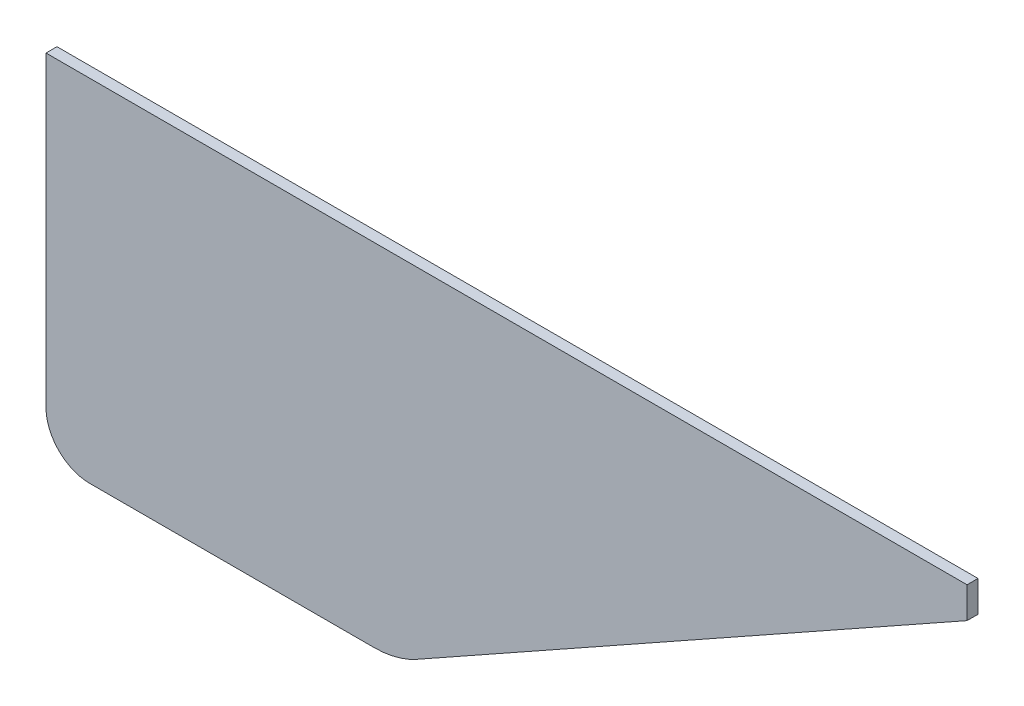
ISO-10303-21;
HEADER;
FILE_DESCRIPTION(('STEP AP214'),'2;1');
FILE_NAME('part.step','',(''),(''),'','','');
FILE_SCHEMA(('AUTOMOTIVE_DESIGN { 1 0 10303 214 1 1 1 1 }'));
ENDSEC;
DATA;
#1=APPLICATION_CONTEXT('core data for automotive mechanical design processes');
#2=APPLICATION_PROTOCOL_DEFINITION('international standard','automotive_design',2000,#1);
#3=PRODUCT_CONTEXT('',#1,'mechanical');
#4=PRODUCT('Part','Part','',(#3));
#5=PRODUCT_RELATED_PRODUCT_CATEGORY('part','',(#4));
#6=PRODUCT_DEFINITION_FORMATION('','',#4);
#7=PRODUCT_DEFINITION_CONTEXT('part definition',#1,'design');
#8=PRODUCT_DEFINITION('design','',#6,#7);
#9=PRODUCT_DEFINITION_SHAPE('','',#8);
#10=(LENGTH_UNIT() NAMED_UNIT(*) SI_UNIT(.MILLI.,.METRE.));
#11=(NAMED_UNIT(*) PLANE_ANGLE_UNIT() SI_UNIT($,.RADIAN.));
#12=(NAMED_UNIT(*) SI_UNIT($,.STERADIAN.) SOLID_ANGLE_UNIT());
#13=UNCERTAINTY_MEASURE_WITH_UNIT(LENGTH_MEASURE(1.E-05),#10,'distance_accuracy_value','');
#14=(GEOMETRIC_REPRESENTATION_CONTEXT(3) GLOBAL_UNCERTAINTY_ASSIGNED_CONTEXT((#13)) GLOBAL_UNIT_ASSIGNED_CONTEXT((#10,
#11,#12)) REPRESENTATION_CONTEXT('',''));
#15=CARTESIAN_POINT('',(0.,0.,0.));
#16=DIRECTION('',(0.,0.,1.));
#17=DIRECTION('',(1.,0.,0.));
#18=AXIS2_PLACEMENT_3D('',#15,#16,#17);
#19=CARTESIAN_POINT('',(0.,-4.5,0.79375));
#20=DIRECTION('',(-1.,0.,0.));
#21=DIRECTION('',(0.,0.,1.));
#22=AXIS2_PLACEMENT_3D('',#19,#20,#21);
#23=PLANE('',#22);
#24=DIRECTION('',(0.,1.,0.));
#25=VECTOR('',#24,1.);
#26=CARTESIAN_POINT('',(0.,-4.5,-0.79375));
#27=LINE('',#26,#25);
#28=CARTESIAN_POINT('',(0.,-4.5,-0.79375));
#29=VERTEX_POINT('',#28);
#30=CARTESIAN_POINT('',(0.,0.,-0.79375));
#31=VERTEX_POINT('',#30);
#32=EDGE_CURVE('E125',#29,#31,#27,.T.);
#33=ORIENTED_EDGE('',*,*,#32,.T.);
#34=DIRECTION('',(0.,0.,-1.));
#35=VECTOR('',#34,1.);
#36=CARTESIAN_POINT('',(0.,0.,0.79375));
#37=LINE('',#36,#35);
#38=CARTESIAN_POINT('',(0.,0.,0.79375));
#39=VERTEX_POINT('',#38);
#40=EDGE_CURVE('E103',#39,#31,#37,.T.);
#41=ORIENTED_EDGE('',*,*,#40,.F.);
#42=DIRECTION('',(0.,1.,0.));
#43=VECTOR('',#42,1.);
#44=CARTESIAN_POINT('',(0.,-4.5,0.79375));
#45=LINE('',#44,#43);
#46=CARTESIAN_POINT('',(0.,-4.5,0.79375));
#47=VERTEX_POINT('',#46);
#48=EDGE_CURVE('E112',#47,#39,#45,.T.);
#49=ORIENTED_EDGE('',*,*,#48,.F.);
#50=DIRECTION('',(0.,0.,-1.));
#51=VECTOR('',#50,1.);
#52=CARTESIAN_POINT('',(0.,-4.5,0.79375));
#53=LINE('',#52,#51);
#54=EDGE_CURVE('E134',#47,#29,#53,.T.);
#55=ORIENTED_EDGE('',*,*,#54,.T.);
#56=EDGE_LOOP('',(#33,#41,#49,#55));
#57=FACE_BOUND('',#56,.T.);
#58=ADVANCED_FACE('F39',(#57),#23,.F.);
#59=CARTESIAN_POINT('',(0.,0.,0.79375));
#60=DIRECTION('',(0.,-1.,0.));
#61=DIRECTION('',(1.,0.,0.));
#62=AXIS2_PLACEMENT_3D('',#59,#60,#61);
#63=PLANE('',#62);
#64=DIRECTION('',(-1.,0.,0.));
#65=VECTOR('',#64,1.);
#66=CARTESIAN_POINT('',(0.,0.,-0.79375));
#67=LINE('',#66,#65);
#68=CARTESIAN_POINT('',(-133.35,0.,-0.79375));
#69=VERTEX_POINT('',#68);
#70=EDGE_CURVE('E175',#31,#69,#67,.T.);
#71=ORIENTED_EDGE('',*,*,#70,.T.);
#72=DIRECTION('',(0.,0.,-1.));
#73=VECTOR('',#72,1.);
#74=CARTESIAN_POINT('',(-133.35,0.,0.79375));
#75=LINE('',#74,#73);
#76=CARTESIAN_POINT('',(-133.35,0.,0.79375));
#77=VERTEX_POINT('',#76);
#78=EDGE_CURVE('E106',#77,#69,#75,.T.);
#79=ORIENTED_EDGE('',*,*,#78,.F.);
#80=DIRECTION('',(-1.,0.,0.));
#81=VECTOR('',#80,1.);
#82=CARTESIAN_POINT('',(0.,0.,0.79375));
#83=LINE('',#82,#81);
#84=EDGE_CURVE('E99',#39,#77,#83,.T.);
#85=ORIENTED_EDGE('',*,*,#84,.F.);
#86=ORIENTED_EDGE('',*,*,#40,.T.);
#87=EDGE_LOOP('',(#71,#79,#85,#86));
#88=FACE_BOUND('',#87,.T.);
#89=ADVANCED_FACE('F101',(#88),#63,.F.);
#90=CARTESIAN_POINT('',(-133.35,0.,0.79375));
#91=DIRECTION('',(1.,0.,0.));
#92=DIRECTION('',(0.,0.,-1.));
#93=AXIS2_PLACEMENT_3D('',#90,#91,#92);
#94=PLANE('',#93);
#95=DIRECTION('',(0.,-1.,0.));
#96=VECTOR('',#95,1.);
#97=CARTESIAN_POINT('',(-133.35,0.,-0.79375));
#98=LINE('',#97,#96);
#99=CARTESIAN_POINT('',(-133.35,-44.45,-0.79375));
#100=VERTEX_POINT('',#99);
#101=EDGE_CURVE('E162',#69,#100,#98,.T.);
#102=ORIENTED_EDGE('',*,*,#101,.T.);
#103=DIRECTION('',(0.,0.,-1.));
#104=VECTOR('',#103,1.);
#105=CARTESIAN_POINT('',(-133.35,-44.45,0.79375));
#106=LINE('',#105,#104);
#107=CARTESIAN_POINT('',(-133.35,-44.45,0.79375));
#108=VERTEX_POINT('',#107);
#109=EDGE_CURVE('E140',#100,#108,#106,.F.);
#110=ORIENTED_EDGE('',*,*,#109,.T.);
#111=DIRECTION('',(0.,-1.,0.));
#112=VECTOR('',#111,1.);
#113=CARTESIAN_POINT('',(-133.35,0.,0.79375));
#114=LINE('',#113,#112);
#115=EDGE_CURVE('E111',#77,#108,#114,.T.);
#116=ORIENTED_EDGE('',*,*,#115,.F.);
#117=ORIENTED_EDGE('',*,*,#78,.T.);
#118=EDGE_LOOP('',(#102,#110,#116,#117));
#119=FACE_BOUND('',#118,.T.);
#120=ADVANCED_FACE('F182',(#119),#94,.F.);
#121=CARTESIAN_POINT('',(-133.35,-50.8,0.79375));
#122=DIRECTION('',(0.,1.,0.));
#123=DIRECTION('',(-1.,0.,0.));
#124=AXIS2_PLACEMENT_3D('',#121,#122,#123);
#125=PLANE('',#124);
#126=DIRECTION('',(1.,0.,0.));
#127=VECTOR('',#126,1.);
#128=CARTESIAN_POINT('',(-133.35,-50.8,-0.79375));
#129=LINE('',#128,#127);
#130=CARTESIAN_POINT('',(-127.,-50.8,-0.79375));
#131=VERTEX_POINT('',#130);
#132=CARTESIAN_POINT('',(-85.8683833966527,-50.8,-0.79375));
#133=VERTEX_POINT('',#132);
#134=EDGE_CURVE('E159',#131,#133,#129,.T.);
#135=ORIENTED_EDGE('',*,*,#134,.T.);
#136=DIRECTION('',(0.,0.,-1.));
#137=VECTOR('',#136,1.);
#138=CARTESIAN_POINT('',(-85.8683833966527,-50.8,0.79375));
#139=LINE('',#138,#137);
#140=CARTESIAN_POINT('',(-85.8683833966527,-50.8,0.79375));
#141=VERTEX_POINT('',#140);
#142=EDGE_CURVE('E48',#133,#141,#139,.F.);
#143=ORIENTED_EDGE('',*,*,#142,.T.);
#144=DIRECTION('',(1.,0.,0.));
#145=VECTOR('',#144,1.);
#146=CARTESIAN_POINT('',(-133.35,-50.8,0.79375));
#147=LINE('',#146,#145);
#148=CARTESIAN_POINT('',(-127.,-50.8,0.79375));
#149=VERTEX_POINT('',#148);
#150=EDGE_CURVE('E167',#149,#141,#147,.T.);
#151=ORIENTED_EDGE('',*,*,#150,.F.);
#152=DIRECTION('',(0.,0.,-1.));
#153=VECTOR('',#152,1.);
#154=CARTESIAN_POINT('',(-127.,-50.8,0.79375));
#155=LINE('',#154,#153);
#156=EDGE_CURVE('E127',#149,#131,#155,.T.);
#157=ORIENTED_EDGE('',*,*,#156,.T.);
#158=EDGE_LOOP('',(#135,#143,#151,#157));
#159=FACE_BOUND('',#158,.T.);
#160=ADVANCED_FACE('F187',(#159),#125,.F.);
#161=CARTESIAN_POINT('',(-82.55,-50.8,0.79375));
#162=DIRECTION('',(-0.489182368770574,0.872181523585549,0.));
#163=DIRECTION('',(-0.872181523585549,-0.489182368770575,0.));
#164=AXIS2_PLACEMENT_3D('',#161,#162,#163);
#165=PLANE('',#164);
#166=DIRECTION('',(0.872181523585549,0.489182368770575,0.));
#167=VECTOR('',#166,1.);
#168=CARTESIAN_POINT('',(-82.55,-50.8,0.79375));
#169=LINE('',#168,#167);
#170=CARTESIAN_POINT('',(-79.6557673132664,-49.1767053495365,0.79375));
#171=VERTEX_POINT('',#170);
#172=EDGE_CURVE('E117',#171,#47,#169,.T.);
#173=ORIENTED_EDGE('',*,*,#172,.F.);
#174=DIRECTION('',(0.,0.,-1.));
#175=VECTOR('',#174,1.);
#176=CARTESIAN_POINT('',(-79.6557673132664,-49.1767053495365,0.79375));
#177=LINE('',#176,#175);
#178=CARTESIAN_POINT('',(-79.6557673132664,-49.1767053495365,-0.79375));
#179=VERTEX_POINT('',#178);
#180=EDGE_CURVE('E146',#171,#179,#177,.T.);
#181=ORIENTED_EDGE('',*,*,#180,.T.);
#182=DIRECTION('',(0.872181523585549,0.489182368770575,0.));
#183=VECTOR('',#182,1.);
#184=CARTESIAN_POINT('',(-82.55,-50.8,-0.79375));
#185=LINE('',#184,#183);
#186=EDGE_CURVE('E122',#179,#29,#185,.T.);
#187=ORIENTED_EDGE('',*,*,#186,.T.);
#188=ORIENTED_EDGE('',*,*,#54,.F.);
#189=EDGE_LOOP('',(#173,#181,#187,#188));
#190=FACE_BOUND('',#189,.T.);
#191=ADVANCED_FACE('F154',(#190),#165,.F.);
#192=CARTESIAN_POINT('',(0.,0.,0.79375));
#193=DIRECTION('',(0.,0.,1.));
#194=DIRECTION('',(1.,0.,0.));
#195=AXIS2_PLACEMENT_3D('',#192,#193,#194);
#196=PLANE('',#195);
#197=ORIENTED_EDGE('',*,*,#150,.T.);
#198=CARTESIAN_POINT('',(-85.8683833966527,-38.1,0.79375));
#199=DIRECTION('',(0.,0.,1.));
#200=DIRECTION('',(1.,0.,0.));
#201=AXIS2_PLACEMENT_3D('',#198,#199,#200);
#202=CIRCLE('',#201,12.7);
#203=EDGE_CURVE('E11',#141,#171,#202,.T.);
#204=ORIENTED_EDGE('',*,*,#203,.T.);
#205=ORIENTED_EDGE('',*,*,#172,.T.);
#206=ORIENTED_EDGE('',*,*,#48,.T.);
#207=ORIENTED_EDGE('',*,*,#84,.T.);
#208=ORIENTED_EDGE('',*,*,#115,.T.);
#209=CARTESIAN_POINT('',(-127.,-44.45,0.79375));
#210=DIRECTION('',(0.,0.,1.));
#211=DIRECTION('',(1.,0.,0.));
#212=AXIS2_PLACEMENT_3D('',#209,#210,#211);
#213=CIRCLE('',#212,6.35);
#214=EDGE_CURVE('E143',#108,#149,#213,.T.);
#215=ORIENTED_EDGE('',*,*,#214,.T.);
#216=EDGE_LOOP('',(#197,#204,#205,#206,#207,#208,#215));
#217=FACE_BOUND('',#216,.T.);
#218=ADVANCED_FACE('F115',(#217),#196,.T.);
#219=CARTESIAN_POINT('',(0.,0.,-0.79375));
#220=DIRECTION('',(0.,0.,1.));
#221=DIRECTION('',(1.,0.,0.));
#222=AXIS2_PLACEMENT_3D('',#219,#220,#221);
#223=PLANE('',#222);
#224=ORIENTED_EDGE('',*,*,#186,.F.);
#225=CARTESIAN_POINT('',(-85.8683833966527,-38.1,-0.79375));
#226=DIRECTION('',(0.,0.,1.));
#227=DIRECTION('',(1.,0.,0.));
#228=AXIS2_PLACEMENT_3D('',#225,#226,#227);
#229=CIRCLE('',#228,12.7);
#230=EDGE_CURVE('E62',#179,#133,#229,.F.);
#231=ORIENTED_EDGE('',*,*,#230,.T.);
#232=ORIENTED_EDGE('',*,*,#134,.F.);
#233=CARTESIAN_POINT('',(-127.,-44.45,-0.79375));
#234=DIRECTION('',(0.,0.,1.));
#235=DIRECTION('',(1.,0.,0.));
#236=AXIS2_PLACEMENT_3D('',#233,#234,#235);
#237=CIRCLE('',#236,6.35);
#238=EDGE_CURVE('E132',#131,#100,#237,.F.);
#239=ORIENTED_EDGE('',*,*,#238,.T.);
#240=ORIENTED_EDGE('',*,*,#101,.F.);
#241=ORIENTED_EDGE('',*,*,#70,.F.);
#242=ORIENTED_EDGE('',*,*,#32,.F.);
#243=EDGE_LOOP('',(#224,#231,#232,#239,#240,#241,#242));
#244=FACE_BOUND('',#243,.T.);
#245=ADVANCED_FACE('F157',(#244),#223,.F.);
#246=CARTESIAN_POINT('',(-127.,-44.45,0.79375));
#247=DIRECTION('',(0.,0.,-1.));
#248=DIRECTION('',(-1.,0.,0.));
#249=AXIS2_PLACEMENT_3D('',#246,#247,#248);
#250=CYLINDRICAL_SURFACE('',#249,6.35);
#251=ORIENTED_EDGE('',*,*,#214,.F.);
#252=ORIENTED_EDGE('',*,*,#109,.F.);
#253=ORIENTED_EDGE('',*,*,#238,.F.);
#254=ORIENTED_EDGE('',*,*,#156,.F.);
#255=EDGE_LOOP('',(#251,#252,#253,#254));
#256=FACE_BOUND('',#255,.T.);
#257=ADVANCED_FACE('F185',(#256),#250,.T.);
#258=CARTESIAN_POINT('',(-85.8683833966527,-38.1,0.79375));
#259=DIRECTION('',(0.,0.,-1.));
#260=DIRECTION('',(-1.,0.,0.));
#261=AXIS2_PLACEMENT_3D('',#258,#259,#260);
#262=CYLINDRICAL_SURFACE('',#261,12.7);
#263=ORIENTED_EDGE('',*,*,#203,.F.);
#264=ORIENTED_EDGE('',*,*,#142,.F.);
#265=ORIENTED_EDGE('',*,*,#230,.F.);
#266=ORIENTED_EDGE('',*,*,#180,.F.);
#267=EDGE_LOOP('',(#263,#264,#265,#266));
#268=FACE_BOUND('',#267,.T.);
#269=ADVANCED_FACE('F41',(#268),#262,.T.);
#270=CLOSED_SHELL('',(#58,#89,#120,#160,#191,#218,#245,#257,#269));
#271=MANIFOLD_SOLID_BREP('B2',#270);
#272=ADVANCED_BREP_SHAPE_REPRESENTATION('',(#18,#271),#14);
#273=SHAPE_DEFINITION_REPRESENTATION(#9,#272);
ENDSEC;
END-ISO-10303-21;
